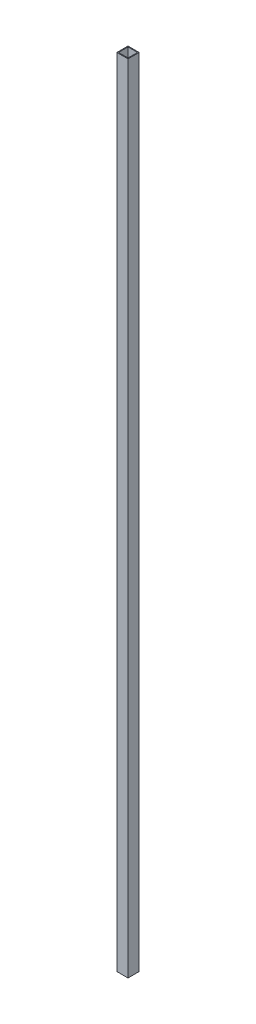
ISO-10303-21;
HEADER;
FILE_DESCRIPTION(('STEP AP214'),'2;1');
FILE_NAME('part.step','',(''),(''),'','','');
FILE_SCHEMA(('AUTOMOTIVE_DESIGN { 1 0 10303 214 1 1 1 1 }'));
ENDSEC;
DATA;
#1=APPLICATION_CONTEXT('core data for automotive mechanical design processes');
#2=APPLICATION_PROTOCOL_DEFINITION('international standard','automotive_design',2000,#1);
#3=PRODUCT_CONTEXT('',#1,'mechanical');
#4=PRODUCT('Part','Part','',(#3));
#5=PRODUCT_RELATED_PRODUCT_CATEGORY('part','',(#4));
#6=PRODUCT_DEFINITION_FORMATION('','',#4);
#7=PRODUCT_DEFINITION_CONTEXT('part definition',#1,'design');
#8=PRODUCT_DEFINITION('design','',#6,#7);
#9=PRODUCT_DEFINITION_SHAPE('','',#8);
#10=(LENGTH_UNIT() NAMED_UNIT(*) SI_UNIT(.MILLI.,.METRE.));
#11=(NAMED_UNIT(*) PLANE_ANGLE_UNIT() SI_UNIT($,.RADIAN.));
#12=(NAMED_UNIT(*) SI_UNIT($,.STERADIAN.) SOLID_ANGLE_UNIT());
#13=UNCERTAINTY_MEASURE_WITH_UNIT(LENGTH_MEASURE(1.E-05),#10,'distance_accuracy_value','');
#14=(GEOMETRIC_REPRESENTATION_CONTEXT(3) GLOBAL_UNCERTAINTY_ASSIGNED_CONTEXT((#13)) GLOBAL_UNIT_ASSIGNED_CONTEXT((#10,
#11,#12)) REPRESENTATION_CONTEXT('',''));
#15=CARTESIAN_POINT('',(0.,0.,0.));
#16=DIRECTION('',(0.,0.,1.));
#17=DIRECTION('',(1.,0.,0.));
#18=AXIS2_PLACEMENT_3D('',#15,#16,#17);
#19=CARTESIAN_POINT('',(0.,1000.,0.));
#20=DIRECTION('',(0.,1.,0.));
#21=DIRECTION('',(0.,0.,1.));
#22=AXIS2_PLACEMENT_3D('',#19,#20,#21);
#23=PLANE('',#22);
#24=DIRECTION('',(-1.,0.,0.));
#25=VECTOR('',#24,1.);
#26=CARTESIAN_POINT('',(0.,1000.,0.));
#27=LINE('',#26,#25);
#28=CARTESIAN_POINT('',(0.,1000.,0.));
#29=VERTEX_POINT('',#28);
#30=CARTESIAN_POINT('',(-14.,1000.,0.));
#31=VERTEX_POINT('',#30);
#32=EDGE_CURVE('E157',#29,#31,#27,.T.);
#33=ORIENTED_EDGE('',*,*,#32,.T.);
#34=DIRECTION('',(0.,0.,1.));
#35=VECTOR('',#34,1.);
#36=CARTESIAN_POINT('',(-14.,1000.,0.));
#37=LINE('',#36,#35);
#38=CARTESIAN_POINT('',(-14.,1000.,14.));
#39=VERTEX_POINT('',#38);
#40=EDGE_CURVE('E160',#31,#39,#37,.T.);
#41=ORIENTED_EDGE('',*,*,#40,.T.);
#42=DIRECTION('',(-1.,0.,0.));
#43=VECTOR('',#42,1.);
#44=CARTESIAN_POINT('',(0.,1000.,14.));
#45=LINE('',#44,#43);
#46=CARTESIAN_POINT('',(0.,1000.,14.));
#47=VERTEX_POINT('',#46);
#48=EDGE_CURVE('E163',#47,#39,#45,.T.);
#49=ORIENTED_EDGE('',*,*,#48,.F.);
#50=DIRECTION('',(0.,0.,1.));
#51=VECTOR('',#50,1.);
#52=CARTESIAN_POINT('',(0.,1000.,0.));
#53=LINE('',#52,#51);
#54=EDGE_CURVE('E166',#29,#47,#53,.T.);
#55=ORIENTED_EDGE('',*,*,#54,.F.);
#56=EDGE_LOOP('',(#33,#41,#49,#55));
#57=FACE_BOUND('',#56,.T.);
#58=DIRECTION('',(0.,0.,1.));
#59=VECTOR('',#58,1.);
#60=CARTESIAN_POINT('',(-13.,1000.,1.));
#61=LINE('',#60,#59);
#62=CARTESIAN_POINT('',(-13.,1000.,1.));
#63=VERTEX_POINT('',#62);
#64=CARTESIAN_POINT('',(-13.,1000.,13.));
#65=VERTEX_POINT('',#64);
#66=EDGE_CURVE('E131',#63,#65,#61,.T.);
#67=ORIENTED_EDGE('',*,*,#66,.F.);
#68=DIRECTION('',(-1.,0.,0.));
#69=VECTOR('',#68,1.);
#70=CARTESIAN_POINT('',(-1.,1000.,1.));
#71=LINE('',#70,#69);
#72=CARTESIAN_POINT('',(-1.,1000.,1.));
#73=VERTEX_POINT('',#72);
#74=EDGE_CURVE('E122',#73,#63,#71,.T.);
#75=ORIENTED_EDGE('',*,*,#74,.F.);
#76=DIRECTION('',(0.,0.,1.));
#77=VECTOR('',#76,1.);
#78=CARTESIAN_POINT('',(-1.,1000.,1.));
#79=LINE('',#78,#77);
#80=CARTESIAN_POINT('',(-1.,1000.,13.));
#81=VERTEX_POINT('',#80);
#82=EDGE_CURVE('E142',#73,#81,#79,.T.);
#83=ORIENTED_EDGE('',*,*,#82,.T.);
#84=DIRECTION('',(-1.,0.,0.));
#85=VECTOR('',#84,1.);
#86=CARTESIAN_POINT('',(-1.,1000.,13.));
#87=LINE('',#86,#85);
#88=EDGE_CURVE('E72',#81,#65,#87,.T.);
#89=ORIENTED_EDGE('',*,*,#88,.T.);
#90=EDGE_LOOP('',(#67,#75,#83,#89));
#91=FACE_BOUND('',#90,.T.);
#92=ADVANCED_FACE('F57',(#57,#91),#23,.T.);
#93=CARTESIAN_POINT('',(0.,0.,0.));
#94=DIRECTION('',(0.,1.,0.));
#95=DIRECTION('',(0.,0.,1.));
#96=AXIS2_PLACEMENT_3D('',#93,#94,#95);
#97=PLANE('',#96);
#98=DIRECTION('',(-1.,0.,0.));
#99=VECTOR('',#98,1.);
#100=CARTESIAN_POINT('',(0.,0.,0.));
#101=LINE('',#100,#99);
#102=CARTESIAN_POINT('',(0.,0.,0.));
#103=VERTEX_POINT('',#102);
#104=CARTESIAN_POINT('',(-14.,0.,0.));
#105=VERTEX_POINT('',#104);
#106=EDGE_CURVE('E138',#103,#105,#101,.T.);
#107=ORIENTED_EDGE('',*,*,#106,.F.);
#108=DIRECTION('',(0.,0.,1.));
#109=VECTOR('',#108,1.);
#110=CARTESIAN_POINT('',(0.,0.,0.));
#111=LINE('',#110,#109);
#112=CARTESIAN_POINT('',(0.,0.,14.));
#113=VERTEX_POINT('',#112);
#114=EDGE_CURVE('E161',#103,#113,#111,.T.);
#115=ORIENTED_EDGE('',*,*,#114,.T.);
#116=DIRECTION('',(-1.,0.,0.));
#117=VECTOR('',#116,1.);
#118=CARTESIAN_POINT('',(0.,0.,14.));
#119=LINE('',#118,#117);
#120=CARTESIAN_POINT('',(-14.,0.,14.));
#121=VERTEX_POINT('',#120);
#122=EDGE_CURVE('E175',#113,#121,#119,.T.);
#123=ORIENTED_EDGE('',*,*,#122,.T.);
#124=DIRECTION('',(0.,0.,1.));
#125=VECTOR('',#124,1.);
#126=CARTESIAN_POINT('',(-14.,0.,0.));
#127=LINE('',#126,#125);
#128=EDGE_CURVE('E172',#105,#121,#127,.T.);
#129=ORIENTED_EDGE('',*,*,#128,.F.);
#130=EDGE_LOOP('',(#107,#115,#123,#129));
#131=FACE_BOUND('',#130,.T.);
#132=DIRECTION('',(-1.,0.,0.));
#133=VECTOR('',#132,1.);
#134=CARTESIAN_POINT('',(-1.,0.,1.));
#135=LINE('',#134,#133);
#136=CARTESIAN_POINT('',(-1.,0.,1.));
#137=VERTEX_POINT('',#136);
#138=CARTESIAN_POINT('',(-13.,0.,1.));
#139=VERTEX_POINT('',#138);
#140=EDGE_CURVE('E80',#137,#139,#135,.T.);
#141=ORIENTED_EDGE('',*,*,#140,.T.);
#142=DIRECTION('',(0.,0.,1.));
#143=VECTOR('',#142,1.);
#144=CARTESIAN_POINT('',(-13.,0.,1.));
#145=LINE('',#144,#143);
#146=CARTESIAN_POINT('',(-13.,0.,13.));
#147=VERTEX_POINT('',#146);
#148=EDGE_CURVE('E137',#139,#147,#145,.T.);
#149=ORIENTED_EDGE('',*,*,#148,.T.);
#150=DIRECTION('',(-1.,0.,0.));
#151=VECTOR('',#150,1.);
#152=CARTESIAN_POINT('',(-1.,0.,13.));
#153=LINE('',#152,#151);
#154=CARTESIAN_POINT('',(-1.,0.,13.));
#155=VERTEX_POINT('',#154);
#156=EDGE_CURVE('E148',#155,#147,#153,.T.);
#157=ORIENTED_EDGE('',*,*,#156,.F.);
#158=DIRECTION('',(0.,0.,1.));
#159=VECTOR('',#158,1.);
#160=CARTESIAN_POINT('',(-1.,0.,1.));
#161=LINE('',#160,#159);
#162=EDGE_CURVE('E132',#137,#155,#161,.T.);
#163=ORIENTED_EDGE('',*,*,#162,.F.);
#164=EDGE_LOOP('',(#141,#149,#157,#163));
#165=FACE_BOUND('',#164,.T.);
#166=ADVANCED_FACE('F192',(#131,#165),#97,.F.);
#167=CARTESIAN_POINT('',(0.,1000.,0.));
#168=DIRECTION('',(0.,0.,1.));
#169=DIRECTION('',(1.,0.,0.));
#170=AXIS2_PLACEMENT_3D('',#167,#168,#169);
#171=PLANE('',#170);
#172=ORIENTED_EDGE('',*,*,#106,.T.);
#173=DIRECTION('',(0.,-1.,0.));
#174=VECTOR('',#173,1.);
#175=CARTESIAN_POINT('',(-14.,1000.,0.));
#176=LINE('',#175,#174);
#177=EDGE_CURVE('E12',#31,#105,#176,.T.);
#178=ORIENTED_EDGE('',*,*,#177,.F.);
#179=ORIENTED_EDGE('',*,*,#32,.F.);
#180=DIRECTION('',(0.,-1.,0.));
#181=VECTOR('',#180,1.);
#182=CARTESIAN_POINT('',(0.,1000.,0.));
#183=LINE('',#182,#181);
#184=EDGE_CURVE('E169',#29,#103,#183,.T.);
#185=ORIENTED_EDGE('',*,*,#184,.T.);
#186=EDGE_LOOP('',(#172,#178,#179,#185));
#187=FACE_BOUND('',#186,.T.);
#188=ADVANCED_FACE('F59',(#187),#171,.F.);
#189=CARTESIAN_POINT('',(-14.,1000.,0.));
#190=DIRECTION('',(1.,0.,0.));
#191=DIRECTION('',(0.,0.,-1.));
#192=AXIS2_PLACEMENT_3D('',#189,#190,#191);
#193=PLANE('',#192);
#194=ORIENTED_EDGE('',*,*,#128,.T.);
#195=DIRECTION('',(0.,-1.,0.));
#196=VECTOR('',#195,1.);
#197=CARTESIAN_POINT('',(-14.,1000.,14.));
#198=LINE('',#197,#196);
#199=EDGE_CURVE('E65',#39,#121,#198,.T.);
#200=ORIENTED_EDGE('',*,*,#199,.F.);
#201=ORIENTED_EDGE('',*,*,#40,.F.);
#202=ORIENTED_EDGE('',*,*,#177,.T.);
#203=EDGE_LOOP('',(#194,#200,#201,#202));
#204=FACE_BOUND('',#203,.T.);
#205=ADVANCED_FACE('F188',(#204),#193,.F.);
#206=CARTESIAN_POINT('',(0.,1000.,14.));
#207=DIRECTION('',(0.,0.,1.));
#208=DIRECTION('',(1.,0.,0.));
#209=AXIS2_PLACEMENT_3D('',#206,#207,#208);
#210=PLANE('',#209);
#211=ORIENTED_EDGE('',*,*,#122,.F.);
#212=DIRECTION('',(0.,-1.,0.));
#213=VECTOR('',#212,1.);
#214=CARTESIAN_POINT('',(0.,1000.,14.));
#215=LINE('',#214,#213);
#216=EDGE_CURVE('E181',#47,#113,#215,.T.);
#217=ORIENTED_EDGE('',*,*,#216,.F.);
#218=ORIENTED_EDGE('',*,*,#48,.T.);
#219=ORIENTED_EDGE('',*,*,#199,.T.);
#220=EDGE_LOOP('',(#211,#217,#218,#219));
#221=FACE_BOUND('',#220,.T.);
#222=ADVANCED_FACE('F185',(#221),#210,.T.);
#223=CARTESIAN_POINT('',(0.,1000.,0.));
#224=DIRECTION('',(1.,0.,0.));
#225=DIRECTION('',(0.,0.,-1.));
#226=AXIS2_PLACEMENT_3D('',#223,#224,#225);
#227=PLANE('',#226);
#228=ORIENTED_EDGE('',*,*,#114,.F.);
#229=ORIENTED_EDGE('',*,*,#184,.F.);
#230=ORIENTED_EDGE('',*,*,#54,.T.);
#231=ORIENTED_EDGE('',*,*,#216,.T.);
#232=EDGE_LOOP('',(#228,#229,#230,#231));
#233=FACE_BOUND('',#232,.T.);
#234=ADVANCED_FACE('F196',(#233),#227,.T.);
#235=CARTESIAN_POINT('',(-1.,1000.,1.));
#236=DIRECTION('',(0.,0.,1.));
#237=DIRECTION('',(1.,0.,0.));
#238=AXIS2_PLACEMENT_3D('',#235,#236,#237);
#239=PLANE('',#238);
#240=ORIENTED_EDGE('',*,*,#140,.F.);
#241=DIRECTION('',(0.,-1.,0.));
#242=VECTOR('',#241,1.);
#243=CARTESIAN_POINT('',(-1.,1000.,1.));
#244=LINE('',#243,#242);
#245=EDGE_CURVE('E126',#73,#137,#244,.T.);
#246=ORIENTED_EDGE('',*,*,#245,.F.);
#247=ORIENTED_EDGE('',*,*,#74,.T.);
#248=DIRECTION('',(0.,-1.,0.));
#249=VECTOR('',#248,1.);
#250=CARTESIAN_POINT('',(-13.,1000.,1.));
#251=LINE('',#250,#249);
#252=EDGE_CURVE('E125',#63,#139,#251,.T.);
#253=ORIENTED_EDGE('',*,*,#252,.T.);
#254=EDGE_LOOP('',(#240,#246,#247,#253));
#255=FACE_BOUND('',#254,.T.);
#256=ADVANCED_FACE('F124',(#255),#239,.T.);
#257=CARTESIAN_POINT('',(-13.,1000.,1.));
#258=DIRECTION('',(1.,0.,0.));
#259=DIRECTION('',(0.,0.,-1.));
#260=AXIS2_PLACEMENT_3D('',#257,#258,#259);
#261=PLANE('',#260);
#262=ORIENTED_EDGE('',*,*,#148,.F.);
#263=ORIENTED_EDGE('',*,*,#252,.F.);
#264=ORIENTED_EDGE('',*,*,#66,.T.);
#265=DIRECTION('',(0.,-1.,0.));
#266=VECTOR('',#265,1.);
#267=CARTESIAN_POINT('',(-13.,1000.,13.));
#268=LINE('',#267,#266);
#269=EDGE_CURVE('E139',#65,#147,#268,.T.);
#270=ORIENTED_EDGE('',*,*,#269,.T.);
#271=EDGE_LOOP('',(#262,#263,#264,#270));
#272=FACE_BOUND('',#271,.T.);
#273=ADVANCED_FACE('F135',(#272),#261,.T.);
#274=CARTESIAN_POINT('',(-1.,1000.,13.));
#275=DIRECTION('',(0.,0.,1.));
#276=DIRECTION('',(1.,0.,0.));
#277=AXIS2_PLACEMENT_3D('',#274,#275,#276);
#278=PLANE('',#277);
#279=ORIENTED_EDGE('',*,*,#156,.T.);
#280=ORIENTED_EDGE('',*,*,#269,.F.);
#281=ORIENTED_EDGE('',*,*,#88,.F.);
#282=DIRECTION('',(0.,-1.,0.));
#283=VECTOR('',#282,1.);
#284=CARTESIAN_POINT('',(-1.,1000.,13.));
#285=LINE('',#284,#283);
#286=EDGE_CURVE('E154',#81,#155,#285,.T.);
#287=ORIENTED_EDGE('',*,*,#286,.T.);
#288=EDGE_LOOP('',(#279,#280,#281,#287));
#289=FACE_BOUND('',#288,.T.);
#290=ADVANCED_FACE('F236',(#289),#278,.F.);
#291=CARTESIAN_POINT('',(-1.,1000.,1.));
#292=DIRECTION('',(1.,0.,0.));
#293=DIRECTION('',(0.,0.,-1.));
#294=AXIS2_PLACEMENT_3D('',#291,#292,#293);
#295=PLANE('',#294);
#296=ORIENTED_EDGE('',*,*,#162,.T.);
#297=ORIENTED_EDGE('',*,*,#286,.F.);
#298=ORIENTED_EDGE('',*,*,#82,.F.);
#299=ORIENTED_EDGE('',*,*,#245,.T.);
#300=EDGE_LOOP('',(#296,#297,#298,#299));
#301=FACE_BOUND('',#300,.T.);
#302=ADVANCED_FACE('F242',(#301),#295,.F.);
#303=CLOSED_SHELL('',(#92,#166,#188,#205,#222,#234,#256,#273,#290,#302));
#304=MANIFOLD_SOLID_BREP('B2',#303);
#305=ADVANCED_BREP_SHAPE_REPRESENTATION('',(#18,#304),#14);
#306=SHAPE_DEFINITION_REPRESENTATION(#9,#305);
ENDSEC;
END-ISO-10303-21;
